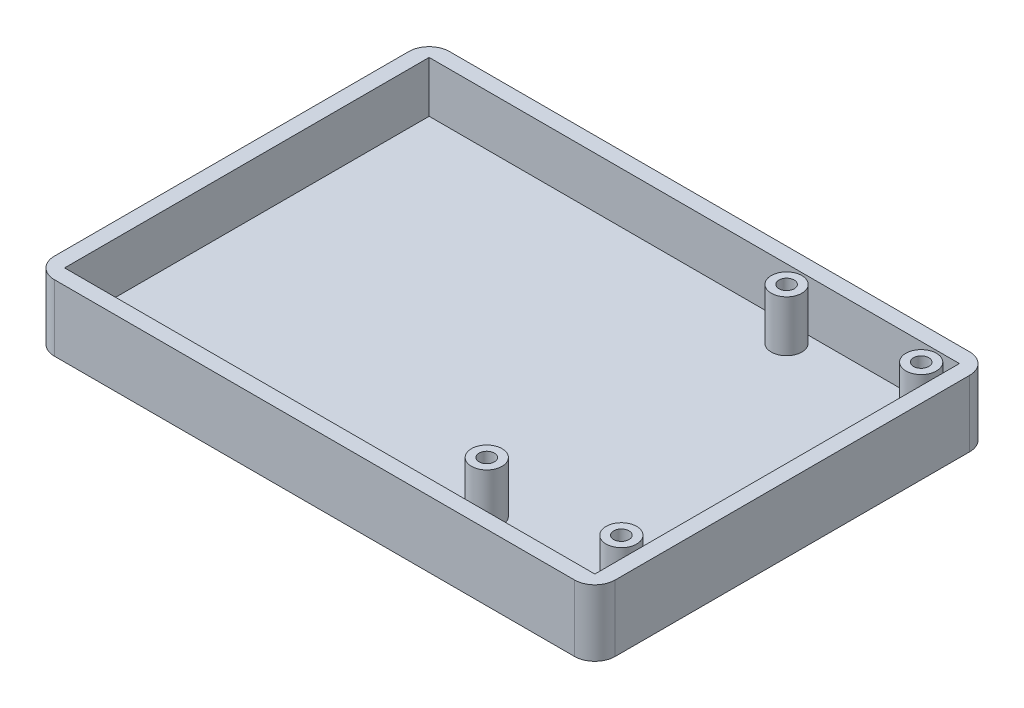
ISO-10303-21;
HEADER;
FILE_DESCRIPTION(('STEP AP214'),'2;1');
FILE_NAME('part.step','',(''),(''),'','','');
FILE_SCHEMA(('AUTOMOTIVE_DESIGN { 1 0 10303 214 1 1 1 1 }'));
ENDSEC;
DATA;
#1=APPLICATION_CONTEXT('core data for automotive mechanical design processes');
#2=APPLICATION_PROTOCOL_DEFINITION('international standard','automotive_design',2000,#1);
#3=PRODUCT_CONTEXT('',#1,'mechanical');
#4=PRODUCT('Part','Part','',(#3));
#5=PRODUCT_RELATED_PRODUCT_CATEGORY('part','',(#4));
#6=PRODUCT_DEFINITION_FORMATION('','',#4);
#7=PRODUCT_DEFINITION_CONTEXT('part definition',#1,'design');
#8=PRODUCT_DEFINITION('design','',#6,#7);
#9=PRODUCT_DEFINITION_SHAPE('','',#8);
#10=(LENGTH_UNIT() NAMED_UNIT(*) SI_UNIT(.MILLI.,.METRE.));
#11=(NAMED_UNIT(*) PLANE_ANGLE_UNIT() SI_UNIT($,.RADIAN.));
#12=(NAMED_UNIT(*) SI_UNIT($,.STERADIAN.) SOLID_ANGLE_UNIT());
#13=UNCERTAINTY_MEASURE_WITH_UNIT(LENGTH_MEASURE(1.E-05),#10,'distance_accuracy_value','');
#14=(GEOMETRIC_REPRESENTATION_CONTEXT(3) GLOBAL_UNCERTAINTY_ASSIGNED_CONTEXT((#13)) GLOBAL_UNIT_ASSIGNED_CONTEXT((#10,
#11,#12)) REPRESENTATION_CONTEXT('',''));
#15=CARTESIAN_POINT('',(0.,0.,0.));
#16=DIRECTION('',(0.,0.,1.));
#17=DIRECTION('',(1.,0.,0.));
#18=AXIS2_PLACEMENT_3D('',#15,#16,#17);
#19=CARTESIAN_POINT('',(103.,10.,-71.));
#20=DIRECTION('',(0.,-1.,0.));
#21=DIRECTION('',(0.,0.,-1.));
#22=AXIS2_PLACEMENT_3D('',#19,#20,#21);
#23=CYLINDRICAL_SURFACE('',#22,3.00000000000001);
#24=CARTESIAN_POINT('',(103.,10.,-71.));
#25=DIRECTION('',(0.,1.,0.));
#26=DIRECTION('',(0.,0.,1.));
#27=AXIS2_PLACEMENT_3D('',#24,#25,#26);
#28=CIRCLE('',#27,3.00000000000001);
#29=CARTESIAN_POINT('',(103.,10.,-68.));
#30=VERTEX_POINT('',#29);
#31=EDGE_CURVE('E121',#30,#30,#28,.T.);
#32=ORIENTED_EDGE('',*,*,#31,.F.);
#33=EDGE_LOOP('',(#32));
#34=FACE_BOUND('',#33,.T.);
#35=CARTESIAN_POINT('',(103.,0.,-71.));
#36=DIRECTION('',(0.,1.,0.));
#37=DIRECTION('',(0.,0.,1.));
#38=AXIS2_PLACEMENT_3D('',#35,#36,#37);
#39=CIRCLE('',#38,3.00000000000001);
#40=CARTESIAN_POINT('',(103.,0.,-68.));
#41=VERTEX_POINT('',#40);
#42=EDGE_CURVE('E127',#41,#41,#39,.T.);
#43=ORIENTED_EDGE('',*,*,#42,.T.);
#44=EDGE_LOOP('',(#43));
#45=FACE_BOUND('',#44,.T.);
#46=ADVANCED_FACE('F114',(#34,#45),#23,.T.);
#47=CARTESIAN_POINT('',(103.,10.,-71.));
#48=DIRECTION('',(0.,-1.,0.));
#49=DIRECTION('',(0.,0.,-1.));
#50=AXIS2_PLACEMENT_3D('',#47,#48,#49);
#51=CYLINDRICAL_SURFACE('',#50,1.5);
#52=CARTESIAN_POINT('',(103.,10.,-71.));
#53=DIRECTION('',(0.,1.,0.));
#54=DIRECTION('',(0.,0.,1.));
#55=AXIS2_PLACEMENT_3D('',#52,#53,#54);
#56=CIRCLE('',#55,1.5);
#57=CARTESIAN_POINT('',(103.,10.,-69.5));
#58=VERTEX_POINT('',#57);
#59=EDGE_CURVE('E12',#58,#58,#56,.T.);
#60=ORIENTED_EDGE('',*,*,#59,.T.);
#61=EDGE_LOOP('',(#60));
#62=FACE_BOUND('',#61,.T.);
#63=CARTESIAN_POINT('',(103.,0.,-71.));
#64=DIRECTION('',(0.,1.,0.));
#65=DIRECTION('',(0.,0.,1.));
#66=AXIS2_PLACEMENT_3D('',#63,#64,#65);
#67=CIRCLE('',#66,1.5);
#68=CARTESIAN_POINT('',(103.,0.,-69.5));
#69=VERTEX_POINT('',#68);
#70=EDGE_CURVE('E117',#69,#69,#67,.T.);
#71=ORIENTED_EDGE('',*,*,#70,.F.);
#72=EDGE_LOOP('',(#71));
#73=FACE_BOUND('',#72,.T.);
#74=ADVANCED_FACE('F136',(#62,#73),#51,.F.);
#75=CARTESIAN_POINT('',(0.,10.,0.));
#76=DIRECTION('',(0.,1.,0.));
#77=DIRECTION('',(0.,0.,1.));
#78=AXIS2_PLACEMENT_3D('',#75,#76,#77);
#79=PLANE('',#78);
#80=ORIENTED_EDGE('',*,*,#31,.T.);
#81=EDGE_LOOP('',(#80));
#82=FACE_BOUND('',#81,.T.);
#83=ORIENTED_EDGE('',*,*,#59,.F.);
#84=EDGE_LOOP('',(#83));
#85=FACE_BOUND('',#84,.T.);
#86=ADVANCED_FACE('F138',(#82,#85),#79,.T.);
#87=CARTESIAN_POINT('',(0.,0.,0.));
#88=DIRECTION('',(0.,1.,0.));
#89=DIRECTION('',(0.,0.,1.));
#90=AXIS2_PLACEMENT_3D('',#87,#88,#89);
#91=PLANE('',#90);
#92=ORIENTED_EDGE('',*,*,#42,.F.);
#93=EDGE_LOOP('',(#92));
#94=FACE_BOUND('',#93,.T.);
#95=ORIENTED_EDGE('',*,*,#70,.T.);
#96=EDGE_LOOP('',(#95));
#97=FACE_BOUND('',#96,.T.);
#98=ADVANCED_FACE('F134',(#94,#97),#91,.F.);
#99=CLOSED_SHELL('',(#46,#74,#86,#98));
#100=MANIFOLD_SOLID_BREP('B2',#99);
#101=CARTESIAN_POINT('',(76.6,10.,-71.));
#102=DIRECTION('',(0.,-1.,0.));
#103=DIRECTION('',(0.,0.,-1.));
#104=AXIS2_PLACEMENT_3D('',#101,#102,#103);
#105=CYLINDRICAL_SURFACE('',#104,1.5);
#106=CARTESIAN_POINT('',(76.6,10.,-71.));
#107=DIRECTION('',(0.,1.,0.));
#108=DIRECTION('',(0.,0.,1.));
#109=AXIS2_PLACEMENT_3D('',#106,#107,#108);
#110=CIRCLE('',#109,1.5);
#111=CARTESIAN_POINT('',(76.6,10.,-69.5));
#112=VERTEX_POINT('',#111);
#113=EDGE_CURVE('E191',#112,#112,#110,.T.);
#114=ORIENTED_EDGE('',*,*,#113,.T.);
#115=EDGE_LOOP('',(#114));
#116=FACE_BOUND('',#115,.T.);
#117=CARTESIAN_POINT('',(76.6,0.,-71.));
#118=DIRECTION('',(0.,1.,0.));
#119=DIRECTION('',(0.,0.,1.));
#120=AXIS2_PLACEMENT_3D('',#117,#118,#119);
#121=CIRCLE('',#120,1.5);
#122=CARTESIAN_POINT('',(76.6,0.,-69.5));
#123=VERTEX_POINT('',#122);
#124=EDGE_CURVE('E197',#123,#123,#121,.T.);
#125=ORIENTED_EDGE('',*,*,#124,.F.);
#126=EDGE_LOOP('',(#125));
#127=FACE_BOUND('',#126,.T.);
#128=ADVANCED_FACE('F184',(#116,#127),#105,.F.);
#129=CARTESIAN_POINT('',(76.6,10.,-71.));
#130=DIRECTION('',(0.,-1.,0.));
#131=DIRECTION('',(0.,0.,-1.));
#132=AXIS2_PLACEMENT_3D('',#129,#130,#131);
#133=CYLINDRICAL_SURFACE('',#132,3.00000000000001);
#134=CARTESIAN_POINT('',(76.6,10.,-71.));
#135=DIRECTION('',(0.,1.,0.));
#136=DIRECTION('',(0.,0.,1.));
#137=AXIS2_PLACEMENT_3D('',#134,#135,#136);
#138=CIRCLE('',#137,3.00000000000001);
#139=CARTESIAN_POINT('',(76.6,10.,-68.));
#140=VERTEX_POINT('',#139);
#141=EDGE_CURVE('E113',#140,#140,#138,.T.);
#142=ORIENTED_EDGE('',*,*,#141,.F.);
#143=EDGE_LOOP('',(#142));
#144=FACE_BOUND('',#143,.T.);
#145=CARTESIAN_POINT('',(76.6,0.,-71.));
#146=DIRECTION('',(0.,1.,0.));
#147=DIRECTION('',(0.,0.,1.));
#148=AXIS2_PLACEMENT_3D('',#145,#146,#147);
#149=CIRCLE('',#148,3.00000000000001);
#150=CARTESIAN_POINT('',(76.6,0.,-68.));
#151=VERTEX_POINT('',#150);
#152=EDGE_CURVE('E187',#151,#151,#149,.T.);
#153=ORIENTED_EDGE('',*,*,#152,.T.);
#154=EDGE_LOOP('',(#153));
#155=FACE_BOUND('',#154,.T.);
#156=ADVANCED_FACE('F204',(#144,#155),#133,.T.);
#157=CARTESIAN_POINT('',(0.,10.,0.));
#158=DIRECTION('',(0.,1.,0.));
#159=DIRECTION('',(0.,0.,1.));
#160=AXIS2_PLACEMENT_3D('',#157,#158,#159);
#161=PLANE('',#160);
#162=ORIENTED_EDGE('',*,*,#113,.F.);
#163=EDGE_LOOP('',(#162));
#164=FACE_BOUND('',#163,.T.);
#165=ORIENTED_EDGE('',*,*,#141,.T.);
#166=EDGE_LOOP('',(#165));
#167=FACE_BOUND('',#166,.T.);
#168=ADVANCED_FACE('F208',(#164,#167),#161,.T.);
#169=CARTESIAN_POINT('',(0.,0.,0.));
#170=DIRECTION('',(0.,1.,0.));
#171=DIRECTION('',(0.,0.,1.));
#172=AXIS2_PLACEMENT_3D('',#169,#170,#171);
#173=PLANE('',#172);
#174=ORIENTED_EDGE('',*,*,#124,.T.);
#175=EDGE_LOOP('',(#174));
#176=FACE_BOUND('',#175,.T.);
#177=ORIENTED_EDGE('',*,*,#152,.F.);
#178=EDGE_LOOP('',(#177));
#179=FACE_BOUND('',#178,.T.);
#180=ADVANCED_FACE('F206',(#176,#179),#173,.F.);
#181=CLOSED_SHELL('',(#128,#156,#168,#180));
#182=MANIFOLD_SOLID_BREP('B7',#181);
#183=CARTESIAN_POINT('',(76.6,10.,-12.2));
#184=DIRECTION('',(0.,-1.,0.));
#185=DIRECTION('',(0.,0.,-1.));
#186=AXIS2_PLACEMENT_3D('',#183,#184,#185);
#187=CYLINDRICAL_SURFACE('',#186,1.5);
#188=CARTESIAN_POINT('',(76.6,10.,-12.2));
#189=DIRECTION('',(0.,1.,0.));
#190=DIRECTION('',(0.,0.,1.));
#191=AXIS2_PLACEMENT_3D('',#188,#189,#190);
#192=CIRCLE('',#191,1.5);
#193=CARTESIAN_POINT('',(76.6,10.,-10.7));
#194=VERTEX_POINT('',#193);
#195=EDGE_CURVE('E261',#194,#194,#192,.T.);
#196=ORIENTED_EDGE('',*,*,#195,.T.);
#197=EDGE_LOOP('',(#196));
#198=FACE_BOUND('',#197,.T.);
#199=CARTESIAN_POINT('',(76.6,0.,-12.2));
#200=DIRECTION('',(0.,1.,0.));
#201=DIRECTION('',(0.,0.,1.));
#202=AXIS2_PLACEMENT_3D('',#199,#200,#201);
#203=CIRCLE('',#202,1.5);
#204=CARTESIAN_POINT('',(76.6,0.,-10.7));
#205=VERTEX_POINT('',#204);
#206=EDGE_CURVE('E267',#205,#205,#203,.T.);
#207=ORIENTED_EDGE('',*,*,#206,.F.);
#208=EDGE_LOOP('',(#207));
#209=FACE_BOUND('',#208,.T.);
#210=ADVANCED_FACE('F254',(#198,#209),#187,.F.);
#211=CARTESIAN_POINT('',(76.6,10.,-12.2));
#212=DIRECTION('',(0.,-1.,0.));
#213=DIRECTION('',(0.,0.,-1.));
#214=AXIS2_PLACEMENT_3D('',#211,#212,#213);
#215=CYLINDRICAL_SURFACE('',#214,3.00000000000001);
#216=CARTESIAN_POINT('',(76.6,10.,-12.2));
#217=DIRECTION('',(0.,1.,0.));
#218=DIRECTION('',(0.,0.,1.));
#219=AXIS2_PLACEMENT_3D('',#216,#217,#218);
#220=CIRCLE('',#219,3.00000000000001);
#221=CARTESIAN_POINT('',(76.6,10.,-9.19999999999999));
#222=VERTEX_POINT('',#221);
#223=EDGE_CURVE('E183',#222,#222,#220,.T.);
#224=ORIENTED_EDGE('',*,*,#223,.F.);
#225=EDGE_LOOP('',(#224));
#226=FACE_BOUND('',#225,.T.);
#227=CARTESIAN_POINT('',(76.6,0.,-12.2));
#228=DIRECTION('',(0.,1.,0.));
#229=DIRECTION('',(0.,0.,1.));
#230=AXIS2_PLACEMENT_3D('',#227,#228,#229);
#231=CIRCLE('',#230,3.00000000000001);
#232=CARTESIAN_POINT('',(76.6,0.,-9.19999999999999));
#233=VERTEX_POINT('',#232);
#234=EDGE_CURVE('E257',#233,#233,#231,.T.);
#235=ORIENTED_EDGE('',*,*,#234,.T.);
#236=EDGE_LOOP('',(#235));
#237=FACE_BOUND('',#236,.T.);
#238=ADVANCED_FACE('F274',(#226,#237),#215,.T.);
#239=CARTESIAN_POINT('',(0.,10.,0.));
#240=DIRECTION('',(0.,1.,0.));
#241=DIRECTION('',(0.,0.,1.));
#242=AXIS2_PLACEMENT_3D('',#239,#240,#241);
#243=PLANE('',#242);
#244=ORIENTED_EDGE('',*,*,#195,.F.);
#245=EDGE_LOOP('',(#244));
#246=FACE_BOUND('',#245,.T.);
#247=ORIENTED_EDGE('',*,*,#223,.T.);
#248=EDGE_LOOP('',(#247));
#249=FACE_BOUND('',#248,.T.);
#250=ADVANCED_FACE('F278',(#246,#249),#243,.T.);
#251=CARTESIAN_POINT('',(0.,0.,0.));
#252=DIRECTION('',(0.,1.,0.));
#253=DIRECTION('',(0.,0.,1.));
#254=AXIS2_PLACEMENT_3D('',#251,#252,#253);
#255=PLANE('',#254);
#256=ORIENTED_EDGE('',*,*,#206,.T.);
#257=EDGE_LOOP('',(#256));
#258=FACE_BOUND('',#257,.T.);
#259=ORIENTED_EDGE('',*,*,#234,.F.);
#260=EDGE_LOOP('',(#259));
#261=FACE_BOUND('',#260,.T.);
#262=ADVANCED_FACE('F276',(#258,#261),#255,.F.);
#263=CLOSED_SHELL('',(#210,#238,#250,#262));
#264=MANIFOLD_SOLID_BREP('B108',#263);
#265=CARTESIAN_POINT('',(103.,10.,-12.2));
#266=DIRECTION('',(0.,-1.,0.));
#267=DIRECTION('',(0.,0.,-1.));
#268=AXIS2_PLACEMENT_3D('',#265,#266,#267);
#269=CYLINDRICAL_SURFACE('',#268,1.5);
#270=CARTESIAN_POINT('',(103.,10.,-12.2));
#271=DIRECTION('',(0.,1.,0.));
#272=DIRECTION('',(0.,0.,1.));
#273=AXIS2_PLACEMENT_3D('',#270,#271,#272);
#274=CIRCLE('',#273,1.5);
#275=CARTESIAN_POINT('',(103.,10.,-10.7));
#276=VERTEX_POINT('',#275);
#277=EDGE_CURVE('E332',#276,#276,#274,.T.);
#278=ORIENTED_EDGE('',*,*,#277,.T.);
#279=EDGE_LOOP('',(#278));
#280=FACE_BOUND('',#279,.T.);
#281=CARTESIAN_POINT('',(103.,0.,-12.2));
#282=DIRECTION('',(0.,1.,0.));
#283=DIRECTION('',(0.,0.,1.));
#284=AXIS2_PLACEMENT_3D('',#281,#282,#283);
#285=CIRCLE('',#284,1.5);
#286=CARTESIAN_POINT('',(103.,0.,-10.7));
#287=VERTEX_POINT('',#286);
#288=EDGE_CURVE('E338',#287,#287,#285,.T.);
#289=ORIENTED_EDGE('',*,*,#288,.F.);
#290=EDGE_LOOP('',(#289));
#291=FACE_BOUND('',#290,.T.);
#292=ADVANCED_FACE('F325',(#280,#291),#269,.F.);
#293=CARTESIAN_POINT('',(103.,10.,-12.2));
#294=DIRECTION('',(0.,-1.,0.));
#295=DIRECTION('',(0.,0.,-1.));
#296=AXIS2_PLACEMENT_3D('',#293,#294,#295);
#297=CYLINDRICAL_SURFACE('',#296,3.00000000000001);
#298=CARTESIAN_POINT('',(103.,10.,-12.2));
#299=DIRECTION('',(0.,1.,0.));
#300=DIRECTION('',(0.,0.,1.));
#301=AXIS2_PLACEMENT_3D('',#298,#299,#300);
#302=CIRCLE('',#301,3.00000000000001);
#303=CARTESIAN_POINT('',(103.,10.,-9.19999999999999));
#304=VERTEX_POINT('',#303);
#305=EDGE_CURVE('E253',#304,#304,#302,.T.);
#306=ORIENTED_EDGE('',*,*,#305,.F.);
#307=EDGE_LOOP('',(#306));
#308=FACE_BOUND('',#307,.T.);
#309=CARTESIAN_POINT('',(103.,0.,-12.2));
#310=DIRECTION('',(0.,1.,0.));
#311=DIRECTION('',(0.,0.,1.));
#312=AXIS2_PLACEMENT_3D('',#309,#310,#311);
#313=CIRCLE('',#312,3.00000000000001);
#314=CARTESIAN_POINT('',(103.,0.,-9.19999999999999));
#315=VERTEX_POINT('',#314);
#316=EDGE_CURVE('E328',#315,#315,#313,.T.);
#317=ORIENTED_EDGE('',*,*,#316,.T.);
#318=EDGE_LOOP('',(#317));
#319=FACE_BOUND('',#318,.T.);
#320=ADVANCED_FACE('F345',(#308,#319),#297,.T.);
#321=CARTESIAN_POINT('',(0.,10.,0.));
#322=DIRECTION('',(0.,1.,0.));
#323=DIRECTION('',(0.,0.,1.));
#324=AXIS2_PLACEMENT_3D('',#321,#322,#323);
#325=PLANE('',#324);
#326=ORIENTED_EDGE('',*,*,#277,.F.);
#327=EDGE_LOOP('',(#326));
#328=FACE_BOUND('',#327,.T.);
#329=ORIENTED_EDGE('',*,*,#305,.T.);
#330=EDGE_LOOP('',(#329));
#331=FACE_BOUND('',#330,.T.);
#332=ADVANCED_FACE('F349',(#328,#331),#325,.T.);
#333=CARTESIAN_POINT('',(0.,0.,0.));
#334=DIRECTION('',(0.,1.,0.));
#335=DIRECTION('',(0.,0.,1.));
#336=AXIS2_PLACEMENT_3D('',#333,#334,#335);
#337=PLANE('',#336);
#338=ORIENTED_EDGE('',*,*,#288,.T.);
#339=EDGE_LOOP('',(#338));
#340=FACE_BOUND('',#339,.T.);
#341=ORIENTED_EDGE('',*,*,#316,.F.);
#342=EDGE_LOOP('',(#341));
#343=FACE_BOUND('',#342,.T.);
#344=ADVANCED_FACE('F347',(#340,#343),#337,.F.);
#345=CLOSED_SHELL('',(#292,#320,#332,#344));
#346=MANIFOLD_SOLID_BREP('B178',#345);
#347=CARTESIAN_POINT('',(3.00000000000001,10.,0.));
#348=DIRECTION('',(1.,0.,0.));
#349=DIRECTION('',(0.,0.,-1.));
#350=AXIS2_PLACEMENT_3D('',#347,#348,#349);
#351=PLANE('',#350);
#352=DIRECTION('',(0.,0.,1.));
#353=VECTOR('',#352,1.);
#354=CARTESIAN_POINT('',(3.00000000000001,0.,0.));
#355=LINE('',#354,#353);
#356=CARTESIAN_POINT('',(3.,0.,-74.5));
#357=VERTEX_POINT('',#356);
#358=CARTESIAN_POINT('',(3.00000000000001,0.,-3.));
#359=VERTEX_POINT('',#358);
#360=EDGE_CURVE('E481',#357,#359,#355,.T.);
#361=ORIENTED_EDGE('',*,*,#360,.F.);
#362=DIRECTION('',(0.,-1.,0.));
#363=VECTOR('',#362,1.);
#364=CARTESIAN_POINT('',(3.,10.,-74.5));
#365=LINE('',#364,#363);
#366=CARTESIAN_POINT('',(3.,10.,-74.5));
#367=VERTEX_POINT('',#366);
#368=EDGE_CURVE('E491',#367,#357,#365,.T.);
#369=ORIENTED_EDGE('',*,*,#368,.F.);
#370=DIRECTION('',(0.,0.,1.));
#371=VECTOR('',#370,1.);
#372=CARTESIAN_POINT('',(3.00000000000001,10.,0.));
#373=LINE('',#372,#371);
#374=CARTESIAN_POINT('',(3.00000000000001,10.,-3.));
#375=VERTEX_POINT('',#374);
#376=EDGE_CURVE('E608',#367,#375,#373,.T.);
#377=ORIENTED_EDGE('',*,*,#376,.T.);
#378=DIRECTION('',(0.,-1.,0.));
#379=VECTOR('',#378,1.);
#380=CARTESIAN_POINT('',(3.00000000000001,10.,-3.));
#381=LINE('',#380,#379);
#382=EDGE_CURVE('E502',#375,#359,#381,.T.);
#383=ORIENTED_EDGE('',*,*,#382,.T.);
#384=EDGE_LOOP('',(#361,#369,#377,#383));
#385=FACE_BOUND('',#384,.T.);
#386=ADVANCED_FACE('F387',(#385),#351,.T.);
#387=CARTESIAN_POINT('',(0.,10.,-74.5));
#388=DIRECTION('',(0.,0.,-1.));
#389=DIRECTION('',(-1.,0.,0.));
#390=AXIS2_PLACEMENT_3D('',#387,#388,#389);
#391=PLANE('',#390);
#392=DIRECTION('',(1.,0.,0.));
#393=VECTOR('',#392,1.);
#394=CARTESIAN_POINT('',(0.,0.,-74.5));
#395=LINE('',#394,#393);
#396=CARTESIAN_POINT('',(107.,0.,-74.5));
#397=VERTEX_POINT('',#396);
#398=EDGE_CURVE('E477',#357,#397,#395,.T.);
#399=ORIENTED_EDGE('',*,*,#398,.T.);
#400=DIRECTION('',(0.,-1.,0.));
#401=VECTOR('',#400,1.);
#402=CARTESIAN_POINT('',(107.,10.,-74.5));
#403=LINE('',#402,#401);
#404=CARTESIAN_POINT('',(107.,10.,-74.5));
#405=VERTEX_POINT('',#404);
#406=EDGE_CURVE('E500',#405,#397,#403,.T.);
#407=ORIENTED_EDGE('',*,*,#406,.F.);
#408=DIRECTION('',(1.,0.,0.));
#409=VECTOR('',#408,1.);
#410=CARTESIAN_POINT('',(0.,10.,-74.5));
#411=LINE('',#410,#409);
#412=EDGE_CURVE('E494',#367,#405,#411,.T.);
#413=ORIENTED_EDGE('',*,*,#412,.F.);
#414=ORIENTED_EDGE('',*,*,#368,.T.);
#415=EDGE_LOOP('',(#399,#407,#413,#414));
#416=FACE_BOUND('',#415,.T.);
#417=ADVANCED_FACE('F492',(#416),#391,.F.);
#418=CARTESIAN_POINT('',(107.,10.,0.));
#419=DIRECTION('',(1.,0.,0.));
#420=DIRECTION('',(0.,0.,-1.));
#421=AXIS2_PLACEMENT_3D('',#418,#419,#420);
#422=PLANE('',#421);
#423=DIRECTION('',(0.,0.,1.));
#424=VECTOR('',#423,1.);
#425=CARTESIAN_POINT('',(107.,0.,0.));
#426=LINE('',#425,#424);
#427=CARTESIAN_POINT('',(107.,0.,-3.));
#428=VERTEX_POINT('',#427);
#429=EDGE_CURVE('E484',#397,#428,#426,.T.);
#430=ORIENTED_EDGE('',*,*,#429,.T.);
#431=DIRECTION('',(0.,-1.,0.));
#432=VECTOR('',#431,1.);
#433=CARTESIAN_POINT('',(107.,10.,-3.));
#434=LINE('',#433,#432);
#435=CARTESIAN_POINT('',(107.,10.,-3.));
#436=VERTEX_POINT('',#435);
#437=EDGE_CURVE('E522',#436,#428,#434,.T.);
#438=ORIENTED_EDGE('',*,*,#437,.F.);
#439=DIRECTION('',(0.,0.,1.));
#440=VECTOR('',#439,1.);
#441=CARTESIAN_POINT('',(107.,10.,0.));
#442=LINE('',#441,#440);
#443=EDGE_CURVE('E612',#405,#436,#442,.T.);
#444=ORIENTED_EDGE('',*,*,#443,.F.);
#445=ORIENTED_EDGE('',*,*,#406,.T.);
#446=EDGE_LOOP('',(#430,#438,#444,#445));
#447=FACE_BOUND('',#446,.T.);
#448=ADVANCED_FACE('F623',(#447),#422,.F.);
#449=CARTESIAN_POINT('',(110.,10.,0.));
#450=DIRECTION('',(1.,0.,0.));
#451=DIRECTION('',(0.,0.,-1.));
#452=AXIS2_PLACEMENT_3D('',#449,#450,#451);
#453=PLANE('',#452);
#454=DIRECTION('',(0.,0.,1.));
#455=VECTOR('',#454,1.);
#456=CARTESIAN_POINT('',(110.,-3.,0.));
#457=LINE('',#456,#455);
#458=CARTESIAN_POINT('',(110.,-3.,-73.5));
#459=VERTEX_POINT('',#458);
#460=CARTESIAN_POINT('',(110.,-3.,-4.));
#461=VERTEX_POINT('',#460);
#462=EDGE_CURVE('E577',#459,#461,#457,.T.);
#463=ORIENTED_EDGE('',*,*,#462,.F.);
#464=DIRECTION('',(0.,-1.,0.));
#465=VECTOR('',#464,1.);
#466=CARTESIAN_POINT('',(110.,10.,-73.5));
#467=LINE('',#466,#465);
#468=CARTESIAN_POINT('',(110.,10.,-73.5));
#469=VERTEX_POINT('',#468);
#470=EDGE_CURVE('E323',#459,#469,#467,.F.);
#471=ORIENTED_EDGE('',*,*,#470,.T.);
#472=DIRECTION('',(0.,0.,1.));
#473=VECTOR('',#472,1.);
#474=CARTESIAN_POINT('',(110.,10.,0.));
#475=LINE('',#474,#473);
#476=CARTESIAN_POINT('',(110.,10.,-4.));
#477=VERTEX_POINT('',#476);
#478=EDGE_CURVE('E519',#469,#477,#475,.T.);
#479=ORIENTED_EDGE('',*,*,#478,.T.);
#480=DIRECTION('',(0.,-1.,0.));
#481=VECTOR('',#480,1.);
#482=CARTESIAN_POINT('',(110.,-3.,-4.));
#483=LINE('',#482,#481);
#484=EDGE_CURVE('E396',#477,#461,#483,.T.);
#485=ORIENTED_EDGE('',*,*,#484,.T.);
#486=EDGE_LOOP('',(#463,#471,#479,#485));
#487=FACE_BOUND('',#486,.T.);
#488=ADVANCED_FACE('F576',(#487),#453,.T.);
#489=CARTESIAN_POINT('',(0.,10.,-77.5));
#490=DIRECTION('',(0.,0.,-1.));
#491=DIRECTION('',(-1.,0.,0.));
#492=AXIS2_PLACEMENT_3D('',#489,#490,#491);
#493=PLANE('',#492);
#494=DIRECTION('',(1.,0.,0.));
#495=VECTOR('',#494,1.);
#496=CARTESIAN_POINT('',(0.,-3.,-77.5));
#497=LINE('',#496,#495);
#498=CARTESIAN_POINT('',(4.,-3.,-77.5));
#499=VERTEX_POINT('',#498);
#500=CARTESIAN_POINT('',(106.,-3.,-77.5));
#501=VERTEX_POINT('',#500);
#502=EDGE_CURVE('E588',#499,#501,#497,.T.);
#503=ORIENTED_EDGE('',*,*,#502,.F.);
#504=DIRECTION('',(0.,-1.,0.));
#505=VECTOR('',#504,1.);
#506=CARTESIAN_POINT('',(4.,10.,-77.5));
#507=LINE('',#506,#505);
#508=CARTESIAN_POINT('',(4.,10.,-77.5));
#509=VERTEX_POINT('',#508);
#510=EDGE_CURVE('E550',#499,#509,#507,.F.);
#511=ORIENTED_EDGE('',*,*,#510,.T.);
#512=DIRECTION('',(1.,0.,0.));
#513=VECTOR('',#512,1.);
#514=CARTESIAN_POINT('',(0.,10.,-77.5));
#515=LINE('',#514,#513);
#516=CARTESIAN_POINT('',(106.,10.,-77.5));
#517=VERTEX_POINT('',#516);
#518=EDGE_CURVE('E598',#509,#517,#515,.T.);
#519=ORIENTED_EDGE('',*,*,#518,.T.);
#520=DIRECTION('',(0.,-1.,0.));
#521=VECTOR('',#520,1.);
#522=CARTESIAN_POINT('',(106.,10.,-77.5));
#523=LINE('',#522,#521);
#524=EDGE_CURVE('E546',#517,#501,#523,.T.);
#525=ORIENTED_EDGE('',*,*,#524,.T.);
#526=EDGE_LOOP('',(#503,#511,#519,#525));
#527=FACE_BOUND('',#526,.T.);
#528=ADVANCED_FACE('F631',(#527),#493,.T.);
#529=CARTESIAN_POINT('',(0.,10.,0.));
#530=DIRECTION('',(1.,0.,0.));
#531=DIRECTION('',(0.,0.,-1.));
#532=AXIS2_PLACEMENT_3D('',#529,#530,#531);
#533=PLANE('',#532);
#534=DIRECTION('',(0.,0.,1.));
#535=VECTOR('',#534,1.);
#536=CARTESIAN_POINT('',(0.,10.,0.));
#537=LINE('',#536,#535);
#538=CARTESIAN_POINT('',(0.,10.,-73.5));
#539=VERTEX_POINT('',#538);
#540=CARTESIAN_POINT('',(0.,10.,-4.));
#541=VERTEX_POINT('',#540);
#542=EDGE_CURVE('E602',#539,#541,#537,.T.);
#543=ORIENTED_EDGE('',*,*,#542,.F.);
#544=DIRECTION('',(0.,-1.,0.));
#545=VECTOR('',#544,1.);
#546=CARTESIAN_POINT('',(0.,-3.,-73.5));
#547=LINE('',#546,#545);
#548=CARTESIAN_POINT('',(0.,-3.,-73.5));
#549=VERTEX_POINT('',#548);
#550=EDGE_CURVE('E530',#539,#549,#547,.T.);
#551=ORIENTED_EDGE('',*,*,#550,.T.);
#552=DIRECTION('',(0.,0.,1.));
#553=VECTOR('',#552,1.);
#554=CARTESIAN_POINT('',(0.,-3.,0.));
#555=LINE('',#554,#553);
#556=CARTESIAN_POINT('',(0.,-3.,-4.));
#557=VERTEX_POINT('',#556);
#558=EDGE_CURVE('E508',#549,#557,#555,.T.);
#559=ORIENTED_EDGE('',*,*,#558,.T.);
#560=DIRECTION('',(0.,-1.,0.));
#561=VECTOR('',#560,1.);
#562=CARTESIAN_POINT('',(0.,10.,-4.));
#563=LINE('',#562,#561);
#564=EDGE_CURVE('E499',#557,#541,#563,.F.);
#565=ORIENTED_EDGE('',*,*,#564,.T.);
#566=EDGE_LOOP('',(#543,#551,#559,#565));
#567=FACE_BOUND('',#566,.T.);
#568=ADVANCED_FACE('F643',(#567),#533,.F.);
#569=CARTESIAN_POINT('',(0.,10.,0.));
#570=DIRECTION('',(0.,0.,-1.));
#571=DIRECTION('',(-1.,0.,0.));
#572=AXIS2_PLACEMENT_3D('',#569,#570,#571);
#573=PLANE('',#572);
#574=DIRECTION('',(1.,0.,0.));
#575=VECTOR('',#574,1.);
#576=CARTESIAN_POINT('',(0.,10.,0.));
#577=LINE('',#576,#575);
#578=CARTESIAN_POINT('',(4.,10.,0.));
#579=VERTEX_POINT('',#578);
#580=CARTESIAN_POINT('',(106.,10.,0.));
#581=VERTEX_POINT('',#580);
#582=EDGE_CURVE('E605',#579,#581,#577,.T.);
#583=ORIENTED_EDGE('',*,*,#582,.F.);
#584=DIRECTION('',(0.,-1.,0.));
#585=VECTOR('',#584,1.);
#586=CARTESIAN_POINT('',(4.,10.,0.));
#587=LINE('',#586,#585);
#588=CARTESIAN_POINT('',(4.,-3.,0.));
#589=VERTEX_POINT('',#588);
#590=EDGE_CURVE('E566',#579,#589,#587,.T.);
#591=ORIENTED_EDGE('',*,*,#590,.T.);
#592=DIRECTION('',(1.,0.,0.));
#593=VECTOR('',#592,1.);
#594=CARTESIAN_POINT('',(0.,-3.,0.));
#595=LINE('',#594,#593);
#596=CARTESIAN_POINT('',(106.,-3.,0.));
#597=VERTEX_POINT('',#596);
#598=EDGE_CURVE('E505',#589,#597,#595,.T.);
#599=ORIENTED_EDGE('',*,*,#598,.T.);
#600=DIRECTION('',(0.,-1.,0.));
#601=VECTOR('',#600,1.);
#602=CARTESIAN_POINT('',(106.,10.,0.));
#603=LINE('',#602,#601);
#604=EDGE_CURVE('E403',#597,#581,#603,.F.);
#605=ORIENTED_EDGE('',*,*,#604,.T.);
#606=EDGE_LOOP('',(#583,#591,#599,#605));
#607=FACE_BOUND('',#606,.T.);
#608=ADVANCED_FACE('F640',(#607),#573,.F.);
#609=CARTESIAN_POINT('',(0.,10.,-3.));
#610=DIRECTION('',(0.,0.,-1.));
#611=DIRECTION('',(-1.,0.,0.));
#612=AXIS2_PLACEMENT_3D('',#609,#610,#611);
#613=PLANE('',#612);
#614=DIRECTION('',(1.,0.,0.));
#615=VECTOR('',#614,1.);
#616=CARTESIAN_POINT('',(0.,0.,-3.));
#617=LINE('',#616,#615);
#618=EDGE_CURVE('E516',#359,#428,#617,.T.);
#619=ORIENTED_EDGE('',*,*,#618,.F.);
#620=ORIENTED_EDGE('',*,*,#382,.F.);
#621=DIRECTION('',(1.,0.,0.));
#622=VECTOR('',#621,1.);
#623=CARTESIAN_POINT('',(0.,10.,-3.));
#624=LINE('',#623,#622);
#625=EDGE_CURVE('E511',#375,#436,#624,.T.);
#626=ORIENTED_EDGE('',*,*,#625,.T.);
#627=ORIENTED_EDGE('',*,*,#437,.T.);
#628=EDGE_LOOP('',(#619,#620,#626,#627));
#629=FACE_BOUND('',#628,.T.);
#630=ADVANCED_FACE('F620',(#629),#613,.T.);
#631=CARTESIAN_POINT('',(0.,10.,0.));
#632=DIRECTION('',(0.,1.,0.));
#633=DIRECTION('',(0.,0.,1.));
#634=AXIS2_PLACEMENT_3D('',#631,#632,#633);
#635=PLANE('',#634);
#636=ORIENTED_EDGE('',*,*,#518,.F.);
#637=CARTESIAN_POINT('',(4.,10.,-73.5));
#638=DIRECTION('',(0.,1.,0.));
#639=DIRECTION('',(0.,0.,1.));
#640=AXIS2_PLACEMENT_3D('',#637,#638,#639);
#641=CIRCLE('',#640,4.);
#642=EDGE_CURVE('E561',#509,#539,#641,.T.);
#643=ORIENTED_EDGE('',*,*,#642,.T.);
#644=ORIENTED_EDGE('',*,*,#542,.T.);
#645=CARTESIAN_POINT('',(4.,10.,-4.));
#646=DIRECTION('',(0.,1.,0.));
#647=DIRECTION('',(0.,0.,1.));
#648=AXIS2_PLACEMENT_3D('',#645,#646,#647);
#649=CIRCLE('',#648,4.);
#650=EDGE_CURVE('E410',#541,#579,#649,.T.);
#651=ORIENTED_EDGE('',*,*,#650,.T.);
#652=ORIENTED_EDGE('',*,*,#582,.T.);
#653=CARTESIAN_POINT('',(106.,10.,-4.));
#654=DIRECTION('',(0.,1.,0.));
#655=DIRECTION('',(0.,0.,1.));
#656=AXIS2_PLACEMENT_3D('',#653,#654,#655);
#657=CIRCLE('',#656,4.);
#658=EDGE_CURVE('E553',#581,#477,#657,.T.);
#659=ORIENTED_EDGE('',*,*,#658,.T.);
#660=ORIENTED_EDGE('',*,*,#478,.F.);
#661=CARTESIAN_POINT('',(106.,10.,-73.5));
#662=DIRECTION('',(0.,1.,0.));
#663=DIRECTION('',(0.,0.,1.));
#664=AXIS2_PLACEMENT_3D('',#661,#662,#663);
#665=CIRCLE('',#664,4.);
#666=EDGE_CURVE('E556',#469,#517,#665,.T.);
#667=ORIENTED_EDGE('',*,*,#666,.T.);
#668=EDGE_LOOP('',(#636,#643,#644,#651,#652,#659,#660,#667));
#669=FACE_BOUND('',#668,.T.);
#670=ORIENTED_EDGE('',*,*,#376,.F.);
#671=ORIENTED_EDGE('',*,*,#412,.T.);
#672=ORIENTED_EDGE('',*,*,#443,.T.);
#673=ORIENTED_EDGE('',*,*,#625,.F.);
#674=EDGE_LOOP('',(#670,#671,#672,#673));
#675=FACE_BOUND('',#674,.T.);
#676=ADVANCED_FACE('F621',(#669,#675),#635,.T.);
#677=CARTESIAN_POINT('',(0.,0.,0.));
#678=DIRECTION('',(0.,1.,0.));
#679=DIRECTION('',(0.,0.,1.));
#680=AXIS2_PLACEMENT_3D('',#677,#678,#679);
#681=PLANE('',#680);
#682=ORIENTED_EDGE('',*,*,#398,.F.);
#683=ORIENTED_EDGE('',*,*,#360,.T.);
#684=ORIENTED_EDGE('',*,*,#618,.T.);
#685=ORIENTED_EDGE('',*,*,#429,.F.);
#686=EDGE_LOOP('',(#682,#683,#684,#685));
#687=FACE_BOUND('',#686,.T.);
#688=ADVANCED_FACE('F479',(#687),#681,.T.);
#689=CARTESIAN_POINT('',(0.,-3.,0.));
#690=DIRECTION('',(0.,1.,0.));
#691=DIRECTION('',(0.,0.,1.));
#692=AXIS2_PLACEMENT_3D('',#689,#690,#691);
#693=PLANE('',#692);
#694=ORIENTED_EDGE('',*,*,#558,.F.);
#695=CARTESIAN_POINT('',(4.,-3.,-73.5));
#696=DIRECTION('',(0.,1.,0.));
#697=DIRECTION('',(0.,0.,1.));
#698=AXIS2_PLACEMENT_3D('',#695,#696,#697);
#699=CIRCLE('',#698,4.);
#700=EDGE_CURVE('E543',#549,#499,#699,.F.);
#701=ORIENTED_EDGE('',*,*,#700,.T.);
#702=ORIENTED_EDGE('',*,*,#502,.T.);
#703=CARTESIAN_POINT('',(106.,-3.,-73.5));
#704=DIRECTION('',(0.,1.,0.));
#705=DIRECTION('',(0.,0.,1.));
#706=AXIS2_PLACEMENT_3D('',#703,#704,#705);
#707=CIRCLE('',#706,4.);
#708=EDGE_CURVE('E537',#501,#459,#707,.F.);
#709=ORIENTED_EDGE('',*,*,#708,.T.);
#710=ORIENTED_EDGE('',*,*,#462,.T.);
#711=CARTESIAN_POINT('',(106.,-3.,-4.));
#712=DIRECTION('',(0.,1.,0.));
#713=DIRECTION('',(0.,0.,1.));
#714=AXIS2_PLACEMENT_3D('',#711,#712,#713);
#715=CIRCLE('',#714,4.);
#716=EDGE_CURVE('E534',#461,#597,#715,.F.);
#717=ORIENTED_EDGE('',*,*,#716,.T.);
#718=ORIENTED_EDGE('',*,*,#598,.F.);
#719=CARTESIAN_POINT('',(4.,-3.,-4.));
#720=DIRECTION('',(0.,1.,0.));
#721=DIRECTION('',(0.,0.,1.));
#722=AXIS2_PLACEMENT_3D('',#719,#720,#721);
#723=CIRCLE('',#722,4.);
#724=EDGE_CURVE('E540',#589,#557,#723,.F.);
#725=ORIENTED_EDGE('',*,*,#724,.T.);
#726=EDGE_LOOP('',(#694,#701,#702,#709,#710,#717,#718,#725));
#727=FACE_BOUND('',#726,.T.);
#728=ADVANCED_FACE('F584',(#727),#693,.F.);
#729=CARTESIAN_POINT('',(4.,10.,-73.5));
#730=DIRECTION('',(0.,1.,0.));
#731=DIRECTION('',(0.,0.,1.));
#732=AXIS2_PLACEMENT_3D('',#729,#730,#731);
#733=CYLINDRICAL_SURFACE('',#732,4.);
#734=ORIENTED_EDGE('',*,*,#642,.F.);
#735=ORIENTED_EDGE('',*,*,#510,.F.);
#736=ORIENTED_EDGE('',*,*,#700,.F.);
#737=ORIENTED_EDGE('',*,*,#550,.F.);
#738=EDGE_LOOP('',(#734,#735,#736,#737));
#739=FACE_BOUND('',#738,.T.);
#740=ADVANCED_FACE('F650',(#739),#733,.T.);
#741=CARTESIAN_POINT('',(4.,10.,-4.));
#742=DIRECTION('',(0.,-1.,0.));
#743=DIRECTION('',(0.,0.,-1.));
#744=AXIS2_PLACEMENT_3D('',#741,#742,#743);
#745=CYLINDRICAL_SURFACE('',#744,4.);
#746=ORIENTED_EDGE('',*,*,#650,.F.);
#747=ORIENTED_EDGE('',*,*,#564,.F.);
#748=ORIENTED_EDGE('',*,*,#724,.F.);
#749=ORIENTED_EDGE('',*,*,#590,.F.);
#750=EDGE_LOOP('',(#746,#747,#748,#749));
#751=FACE_BOUND('',#750,.T.);
#752=ADVANCED_FACE('F653',(#751),#745,.T.);
#753=CARTESIAN_POINT('',(106.,10.,-73.5));
#754=DIRECTION('',(0.,-1.,0.));
#755=DIRECTION('',(0.,0.,-1.));
#756=AXIS2_PLACEMENT_3D('',#753,#754,#755);
#757=CYLINDRICAL_SURFACE('',#756,4.);
#758=ORIENTED_EDGE('',*,*,#666,.F.);
#759=ORIENTED_EDGE('',*,*,#470,.F.);
#760=ORIENTED_EDGE('',*,*,#708,.F.);
#761=ORIENTED_EDGE('',*,*,#524,.F.);
#762=EDGE_LOOP('',(#758,#759,#760,#761));
#763=FACE_BOUND('',#762,.T.);
#764=ADVANCED_FACE('F656',(#763),#757,.T.);
#765=CARTESIAN_POINT('',(106.,10.,-4.));
#766=DIRECTION('',(0.,1.,0.));
#767=DIRECTION('',(0.,0.,1.));
#768=AXIS2_PLACEMENT_3D('',#765,#766,#767);
#769=CYLINDRICAL_SURFACE('',#768,4.);
#770=ORIENTED_EDGE('',*,*,#658,.F.);
#771=ORIENTED_EDGE('',*,*,#604,.F.);
#772=ORIENTED_EDGE('',*,*,#716,.F.);
#773=ORIENTED_EDGE('',*,*,#484,.F.);
#774=EDGE_LOOP('',(#770,#771,#772,#773));
#775=FACE_BOUND('',#774,.T.);
#776=ADVANCED_FACE('F389',(#775),#769,.T.);
#777=CLOSED_SHELL('',(#386,#417,#448,#488,#528,#568,#608,#630,#676,#688,#728,#740,#752,#764,#776));
#778=MANIFOLD_SOLID_BREP('B248',#777);
#779=ADVANCED_BREP_SHAPE_REPRESENTATION('',(#18,#100,#182,#264,#346,#778),#14);
#780=SHAPE_DEFINITION_REPRESENTATION(#9,#779);
ENDSEC;
END-ISO-10303-21;
